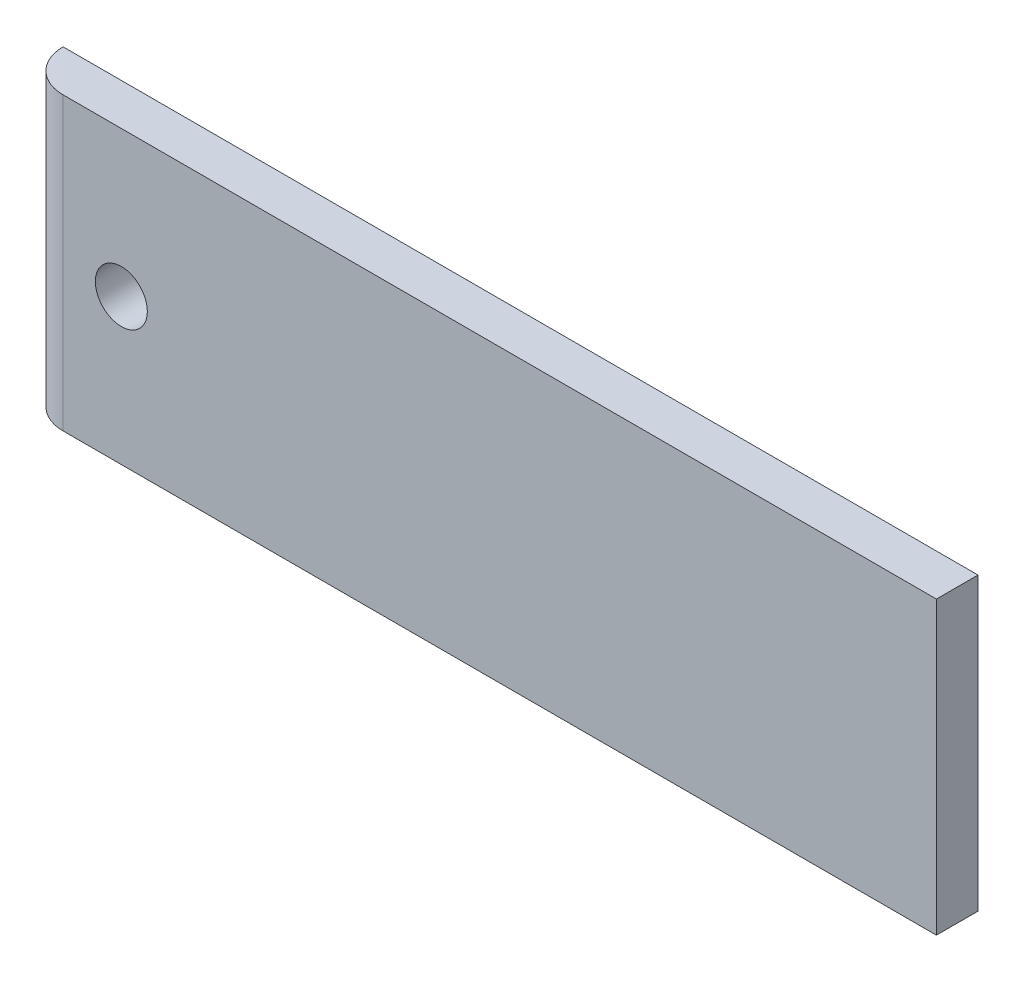
ISO-10303-21;
HEADER;
FILE_DESCRIPTION(('STEP AP214'),'2;1');
FILE_NAME('part.step','',(''),(''),'','','');
FILE_SCHEMA(('AUTOMOTIVE_DESIGN { 1 0 10303 214 1 1 1 1 }'));
ENDSEC;
DATA;
#1=APPLICATION_CONTEXT('core data for automotive mechanical design processes');
#2=APPLICATION_PROTOCOL_DEFINITION('international standard','automotive_design',2000,#1);
#3=PRODUCT_CONTEXT('',#1,'mechanical');
#4=PRODUCT('Part','Part','',(#3));
#5=PRODUCT_RELATED_PRODUCT_CATEGORY('part','',(#4));
#6=PRODUCT_DEFINITION_FORMATION('','',#4);
#7=PRODUCT_DEFINITION_CONTEXT('part definition',#1,'design');
#8=PRODUCT_DEFINITION('design','',#6,#7);
#9=PRODUCT_DEFINITION_SHAPE('','',#8);
#10=(LENGTH_UNIT() NAMED_UNIT(*) SI_UNIT(.MILLI.,.METRE.));
#11=(NAMED_UNIT(*) PLANE_ANGLE_UNIT() SI_UNIT($,.RADIAN.));
#12=(NAMED_UNIT(*) SI_UNIT($,.STERADIAN.) SOLID_ANGLE_UNIT());
#13=UNCERTAINTY_MEASURE_WITH_UNIT(LENGTH_MEASURE(1.E-05),#10,'distance_accuracy_value','');
#14=(GEOMETRIC_REPRESENTATION_CONTEXT(3) GLOBAL_UNCERTAINTY_ASSIGNED_CONTEXT((#13)) GLOBAL_UNIT_ASSIGNED_CONTEXT((#10,
#11,#12)) REPRESENTATION_CONTEXT('',''));
#15=CARTESIAN_POINT('',(0.,0.,0.));
#16=DIRECTION('',(0.,0.,1.));
#17=DIRECTION('',(1.,0.,0.));
#18=AXIS2_PLACEMENT_3D('',#15,#16,#17);
#19=CARTESIAN_POINT('',(0.,44.45,0.));
#20=DIRECTION('',(0.,0.,-1.));
#21=DIRECTION('',(-1.,0.,0.));
#22=AXIS2_PLACEMENT_3D('',#19,#20,#21);
#23=PLANE('',#22);
#24=CARTESIAN_POINT('',(15.24,22.225,0.));
#25=DIRECTION('',(0.,0.,1.));
#26=DIRECTION('',(1.,0.,0.));
#27=AXIS2_PLACEMENT_3D('',#24,#25,#26);
#28=CIRCLE('',#27,3.96874999999998);
#29=CARTESIAN_POINT('',(19.20875,22.225,0.));
#30=VERTEX_POINT('',#29);
#31=EDGE_CURVE('E175',#30,#30,#28,.T.);
#32=ORIENTED_EDGE('',*,*,#31,.F.);
#33=EDGE_LOOP('',(#32));
#34=FACE_BOUND('',#33,.T.);
#35=DIRECTION('',(1.,0.,0.));
#36=VECTOR('',#35,1.);
#37=CARTESIAN_POINT('',(0.,44.45,0.));
#38=LINE('',#37,#36);
#39=CARTESIAN_POINT('',(6.35,44.45,0.));
#40=VERTEX_POINT('',#39);
#41=CARTESIAN_POINT('',(139.7,44.45,0.));
#42=VERTEX_POINT('',#41);
#43=EDGE_CURVE('E72',#40,#42,#38,.T.);
#44=ORIENTED_EDGE('',*,*,#43,.F.);
#45=DIRECTION('',(0.,-1.,0.));
#46=VECTOR('',#45,1.);
#47=CARTESIAN_POINT('',(6.35,44.45,0.));
#48=LINE('',#47,#46);
#49=CARTESIAN_POINT('',(6.35,0.,0.));
#50=VERTEX_POINT('',#49);
#51=EDGE_CURVE('E87',#40,#50,#48,.T.);
#52=ORIENTED_EDGE('',*,*,#51,.T.);
#53=DIRECTION('',(1.,0.,0.));
#54=VECTOR('',#53,1.);
#55=CARTESIAN_POINT('',(0.,0.,0.));
#56=LINE('',#55,#54);
#57=CARTESIAN_POINT('',(139.7,0.,0.));
#58=VERTEX_POINT('',#57);
#59=EDGE_CURVE('E84',#50,#58,#56,.T.);
#60=ORIENTED_EDGE('',*,*,#59,.T.);
#61=DIRECTION('',(0.,-1.,0.));
#62=VECTOR('',#61,1.);
#63=CARTESIAN_POINT('',(139.7,44.45,0.));
#64=LINE('',#63,#62);
#65=EDGE_CURVE('E82',#42,#58,#64,.T.);
#66=ORIENTED_EDGE('',*,*,#65,.F.);
#67=EDGE_LOOP('',(#44,#52,#60,#66));
#68=FACE_BOUND('',#67,.T.);
#69=ADVANCED_FACE('F35',(#34,#68),#23,.F.);
#70=CARTESIAN_POINT('',(139.7,44.45,0.));
#71=DIRECTION('',(-1.,0.,0.));
#72=DIRECTION('',(0.,0.,1.));
#73=AXIS2_PLACEMENT_3D('',#70,#71,#72);
#74=PLANE('',#73);
#75=DIRECTION('',(0.,0.,-1.));
#76=VECTOR('',#75,1.);
#77=CARTESIAN_POINT('',(139.7,0.,0.));
#78=LINE('',#77,#76);
#79=CARTESIAN_POINT('',(139.7,0.,-6.35));
#80=VERTEX_POINT('',#79);
#81=EDGE_CURVE('E100',#58,#80,#78,.T.);
#82=ORIENTED_EDGE('',*,*,#81,.T.);
#83=DIRECTION('',(0.,-1.,0.));
#84=VECTOR('',#83,1.);
#85=CARTESIAN_POINT('',(139.7,44.45,-6.35));
#86=LINE('',#85,#84);
#87=CARTESIAN_POINT('',(139.7,44.45,-6.35));
#88=VERTEX_POINT('',#87);
#89=EDGE_CURVE('E88',#88,#80,#86,.T.);
#90=ORIENTED_EDGE('',*,*,#89,.F.);
#91=DIRECTION('',(0.,0.,-1.));
#92=VECTOR('',#91,1.);
#93=CARTESIAN_POINT('',(139.7,44.45,0.));
#94=LINE('',#93,#92);
#95=EDGE_CURVE('E76',#42,#88,#94,.T.);
#96=ORIENTED_EDGE('',*,*,#95,.F.);
#97=ORIENTED_EDGE('',*,*,#65,.T.);
#98=EDGE_LOOP('',(#82,#90,#96,#97));
#99=FACE_BOUND('',#98,.T.);
#100=ADVANCED_FACE('F90',(#99),#74,.F.);
#101=CARTESIAN_POINT('',(0.,44.45,-6.35));
#102=DIRECTION('',(0.,0.,1.));
#103=DIRECTION('',(1.,0.,0.));
#104=AXIS2_PLACEMENT_3D('',#101,#102,#103);
#105=PLANE('',#104);
#106=CARTESIAN_POINT('',(15.24,22.225,-6.34999999999999));
#107=DIRECTION('',(0.,0.,1.));
#108=DIRECTION('',(1.,0.,0.));
#109=AXIS2_PLACEMENT_3D('',#106,#107,#108);
#110=CIRCLE('',#109,3.96874999999998);
#111=CARTESIAN_POINT('',(19.20875,22.225,-6.34999999999999));
#112=VERTEX_POINT('',#111);
#113=EDGE_CURVE('E39',#112,#112,#110,.T.);
#114=ORIENTED_EDGE('',*,*,#113,.T.);
#115=EDGE_LOOP('',(#114));
#116=FACE_BOUND('',#115,.T.);
#117=DIRECTION('',(-1.,0.,0.));
#118=VECTOR('',#117,1.);
#119=CARTESIAN_POINT('',(0.,0.,-6.35));
#120=LINE('',#119,#118);
#121=CARTESIAN_POINT('',(0.,0.,-6.35));
#122=VERTEX_POINT('',#121);
#123=EDGE_CURVE('E79',#80,#122,#120,.T.);
#124=ORIENTED_EDGE('',*,*,#123,.T.);
#125=DIRECTION('',(0.,-1.,0.));
#126=VECTOR('',#125,1.);
#127=CARTESIAN_POINT('',(0.,44.45,-6.35));
#128=LINE('',#127,#126);
#129=CARTESIAN_POINT('',(0.,44.45,-6.35));
#130=VERTEX_POINT('',#129);
#131=EDGE_CURVE('E95',#130,#122,#128,.T.);
#132=ORIENTED_EDGE('',*,*,#131,.F.);
#133=DIRECTION('',(-1.,0.,0.));
#134=VECTOR('',#133,1.);
#135=CARTESIAN_POINT('',(0.,44.45,-6.35));
#136=LINE('',#135,#134);
#137=EDGE_CURVE('E93',#88,#130,#136,.T.);
#138=ORIENTED_EDGE('',*,*,#137,.F.);
#139=ORIENTED_EDGE('',*,*,#89,.T.);
#140=EDGE_LOOP('',(#124,#132,#138,#139));
#141=FACE_BOUND('',#140,.T.);
#142=ADVANCED_FACE('F112',(#116,#141),#105,.F.);
#143=CARTESIAN_POINT('',(0.,44.45,0.));
#144=DIRECTION('',(0.,-1.,0.));
#145=DIRECTION('',(0.,0.,-1.));
#146=AXIS2_PLACEMENT_3D('',#143,#144,#145);
#147=PLANE('',#146);
#148=ORIENTED_EDGE('',*,*,#137,.T.);
#149=CARTESIAN_POINT('',(6.35,44.45,-6.35));
#150=DIRECTION('',(0.,-1.,0.));
#151=DIRECTION('',(0.,0.,-1.));
#152=AXIS2_PLACEMENT_3D('',#149,#150,#151);
#153=CIRCLE('',#152,6.35);
#154=EDGE_CURVE('E11',#130,#40,#153,.F.);
#155=ORIENTED_EDGE('',*,*,#154,.T.);
#156=ORIENTED_EDGE('',*,*,#43,.T.);
#157=ORIENTED_EDGE('',*,*,#95,.T.);
#158=EDGE_LOOP('',(#148,#155,#156,#157));
#159=FACE_BOUND('',#158,.T.);
#160=ADVANCED_FACE('F74',(#159),#147,.F.);
#161=CARTESIAN_POINT('',(0.,0.,0.));
#162=DIRECTION('',(0.,-1.,0.));
#163=DIRECTION('',(0.,0.,-1.));
#164=AXIS2_PLACEMENT_3D('',#161,#162,#163);
#165=PLANE('',#164);
#166=ORIENTED_EDGE('',*,*,#59,.F.);
#167=CARTESIAN_POINT('',(6.35,0.,-6.35));
#168=DIRECTION('',(0.,-1.,0.));
#169=DIRECTION('',(0.,0.,-1.));
#170=AXIS2_PLACEMENT_3D('',#167,#168,#169);
#171=CIRCLE('',#170,6.35);
#172=EDGE_CURVE('E44',#50,#122,#171,.T.);
#173=ORIENTED_EDGE('',*,*,#172,.T.);
#174=ORIENTED_EDGE('',*,*,#123,.F.);
#175=ORIENTED_EDGE('',*,*,#81,.F.);
#176=EDGE_LOOP('',(#166,#173,#174,#175));
#177=FACE_BOUND('',#176,.T.);
#178=ADVANCED_FACE('F109',(#177),#165,.T.);
#179=CARTESIAN_POINT('',(6.35,44.45,-6.35));
#180=DIRECTION('',(0.,-1.,0.));
#181=DIRECTION('',(0.,0.,-1.));
#182=AXIS2_PLACEMENT_3D('',#179,#180,#181);
#183=CYLINDRICAL_SURFACE('',#182,6.35);
#184=ORIENTED_EDGE('',*,*,#154,.F.);
#185=ORIENTED_EDGE('',*,*,#131,.T.);
#186=ORIENTED_EDGE('',*,*,#172,.F.);
#187=ORIENTED_EDGE('',*,*,#51,.F.);
#188=EDGE_LOOP('',(#184,#185,#186,#187));
#189=FACE_BOUND('',#188,.T.);
#190=ADVANCED_FACE('F37',(#189),#183,.T.);
#191=CARTESIAN_POINT('',(15.24,22.225,-254.));
#192=DIRECTION('',(0.,0.,1.));
#193=DIRECTION('',(1.,0.,0.));
#194=AXIS2_PLACEMENT_3D('',#191,#192,#193);
#195=CYLINDRICAL_SURFACE('',#194,3.96874999999998);
#196=ORIENTED_EDGE('',*,*,#31,.T.);
#197=EDGE_LOOP('',(#196));
#198=FACE_BOUND('',#197,.T.);
#199=ORIENTED_EDGE('',*,*,#113,.F.);
#200=EDGE_LOOP('',(#199));
#201=FACE_BOUND('',#200,.T.);
#202=ADVANCED_FACE('F114',(#198,#201),#195,.F.);
#203=CLOSED_SHELL('',(#69,#100,#142,#160,#178,#190,#202));
#204=MANIFOLD_SOLID_BREP('B2',#203);
#205=ADVANCED_BREP_SHAPE_REPRESENTATION('',(#18,#204),#14);
#206=SHAPE_DEFINITION_REPRESENTATION(#9,#205);
ENDSEC;
END-ISO-10303-21;
